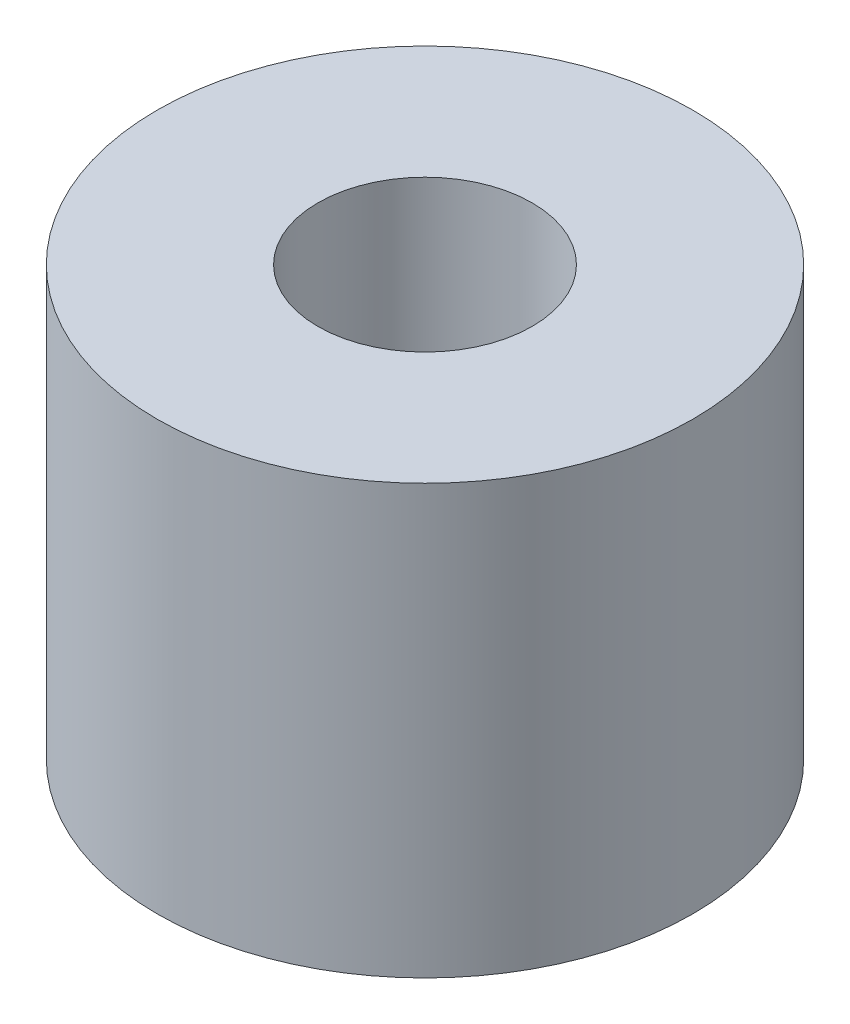
ISO-10303-21;
HEADER;
FILE_DESCRIPTION(('STEP AP214'),'2;1');
FILE_NAME('part.step','',(''),(''),'','','');
FILE_SCHEMA(('AUTOMOTIVE_DESIGN { 1 0 10303 214 1 1 1 1 }'));
ENDSEC;
DATA;
#1=APPLICATION_CONTEXT('core data for automotive mechanical design processes');
#2=APPLICATION_PROTOCOL_DEFINITION('international standard','automotive_design',2000,#1);
#3=PRODUCT_CONTEXT('',#1,'mechanical');
#4=PRODUCT('Part','Part','',(#3));
#5=PRODUCT_RELATED_PRODUCT_CATEGORY('part','',(#4));
#6=PRODUCT_DEFINITION_FORMATION('','',#4);
#7=PRODUCT_DEFINITION_CONTEXT('part definition',#1,'design');
#8=PRODUCT_DEFINITION('design','',#6,#7);
#9=PRODUCT_DEFINITION_SHAPE('','',#8);
#10=(LENGTH_UNIT() NAMED_UNIT(*) SI_UNIT(.MILLI.,.METRE.));
#11=(NAMED_UNIT(*) PLANE_ANGLE_UNIT() SI_UNIT($,.RADIAN.));
#12=(NAMED_UNIT(*) SI_UNIT($,.STERADIAN.) SOLID_ANGLE_UNIT());
#13=UNCERTAINTY_MEASURE_WITH_UNIT(LENGTH_MEASURE(1.E-05),#10,'distance_accuracy_value','');
#14=(GEOMETRIC_REPRESENTATION_CONTEXT(3) GLOBAL_UNCERTAINTY_ASSIGNED_CONTEXT((#13)) GLOBAL_UNIT_ASSIGNED_CONTEXT((#10,
#11,#12)) REPRESENTATION_CONTEXT('',''));
#15=CARTESIAN_POINT('',(0.,0.,0.));
#16=DIRECTION('',(0.,0.,1.));
#17=DIRECTION('',(1.,0.,0.));
#18=AXIS2_PLACEMENT_3D('',#15,#16,#17);
#19=CARTESIAN_POINT('',(0.,12.,0.));
#20=DIRECTION('',(0.,1.,0.));
#21=DIRECTION('',(0.,0.,1.));
#22=AXIS2_PLACEMENT_3D('',#19,#20,#21);
#23=PLANE('',#22);
#24=CARTESIAN_POINT('',(0.,12.,0.));
#25=DIRECTION('',(0.,1.,0.));
#26=DIRECTION('',(0.,0.,1.));
#27=AXIS2_PLACEMENT_3D('',#24,#25,#26);
#28=CIRCLE('',#27,7.5);
#29=CARTESIAN_POINT('',(0.,12.,7.5));
#30=VERTEX_POINT('',#29);
#31=EDGE_CURVE('E11',#30,#30,#28,.T.);
#32=ORIENTED_EDGE('',*,*,#31,.T.);
#33=EDGE_LOOP('',(#32));
#34=FACE_BOUND('',#33,.T.);
#35=CARTESIAN_POINT('',(0.,12.,0.));
#36=DIRECTION('',(0.,1.,0.));
#37=DIRECTION('',(0.,0.,1.));
#38=AXIS2_PLACEMENT_3D('',#35,#36,#37);
#39=CIRCLE('',#38,3.);
#40=CARTESIAN_POINT('',(0.,12.,3.));
#41=VERTEX_POINT('',#40);
#42=EDGE_CURVE('E62',#41,#41,#39,.T.);
#43=ORIENTED_EDGE('',*,*,#42,.F.);
#44=EDGE_LOOP('',(#43));
#45=FACE_BOUND('',#44,.T.);
#46=ADVANCED_FACE('F49',(#34,#45),#23,.T.);
#47=CARTESIAN_POINT('',(0.,0.,0.));
#48=DIRECTION('',(0.,1.,0.));
#49=DIRECTION('',(0.,0.,1.));
#50=AXIS2_PLACEMENT_3D('',#47,#48,#49);
#51=PLANE('',#50);
#52=CARTESIAN_POINT('',(0.,0.,0.));
#53=DIRECTION('',(0.,1.,0.));
#54=DIRECTION('',(0.,0.,1.));
#55=AXIS2_PLACEMENT_3D('',#52,#53,#54);
#56=CIRCLE('',#55,7.5);
#57=CARTESIAN_POINT('',(0.,0.,7.5));
#58=VERTEX_POINT('',#57);
#59=EDGE_CURVE('E53',#58,#58,#56,.T.);
#60=ORIENTED_EDGE('',*,*,#59,.F.);
#61=EDGE_LOOP('',(#60));
#62=FACE_BOUND('',#61,.T.);
#63=CARTESIAN_POINT('',(0.,0.,0.));
#64=DIRECTION('',(0.,1.,0.));
#65=DIRECTION('',(0.,0.,1.));
#66=AXIS2_PLACEMENT_3D('',#63,#64,#65);
#67=CIRCLE('',#66,3.);
#68=CARTESIAN_POINT('',(0.,0.,3.));
#69=VERTEX_POINT('',#68);
#70=EDGE_CURVE('E64',#69,#69,#67,.T.);
#71=ORIENTED_EDGE('',*,*,#70,.T.);
#72=EDGE_LOOP('',(#71));
#73=FACE_BOUND('',#72,.T.);
#74=ADVANCED_FACE('F76',(#62,#73),#51,.F.);
#75=CARTESIAN_POINT('',(0.,12.,0.));
#76=DIRECTION('',(0.,-1.,0.));
#77=DIRECTION('',(0.,0.,-1.));
#78=AXIS2_PLACEMENT_3D('',#75,#76,#77);
#79=CYLINDRICAL_SURFACE('',#78,7.5);
#80=ORIENTED_EDGE('',*,*,#31,.F.);
#81=EDGE_LOOP('',(#80));
#82=FACE_BOUND('',#81,.T.);
#83=ORIENTED_EDGE('',*,*,#59,.T.);
#84=EDGE_LOOP('',(#83));
#85=FACE_BOUND('',#84,.T.);
#86=ADVANCED_FACE('F51',(#82,#85),#79,.T.);
#87=CARTESIAN_POINT('',(0.,12.,0.));
#88=DIRECTION('',(0.,-1.,0.));
#89=DIRECTION('',(0.,0.,-1.));
#90=AXIS2_PLACEMENT_3D('',#87,#88,#89);
#91=CYLINDRICAL_SURFACE('',#90,3.);
#92=ORIENTED_EDGE('',*,*,#42,.T.);
#93=EDGE_LOOP('',(#92));
#94=FACE_BOUND('',#93,.T.);
#95=ORIENTED_EDGE('',*,*,#70,.F.);
#96=EDGE_LOOP('',(#95));
#97=FACE_BOUND('',#96,.T.);
#98=ADVANCED_FACE('F72',(#94,#97),#91,.F.);
#99=CLOSED_SHELL('',(#46,#74,#86,#98));
#100=MANIFOLD_SOLID_BREP('B2',#99);
#101=ADVANCED_BREP_SHAPE_REPRESENTATION('',(#18,#100),#14);
#102=SHAPE_DEFINITION_REPRESENTATION(#9,#101);
ENDSEC;
END-ISO-10303-21;
